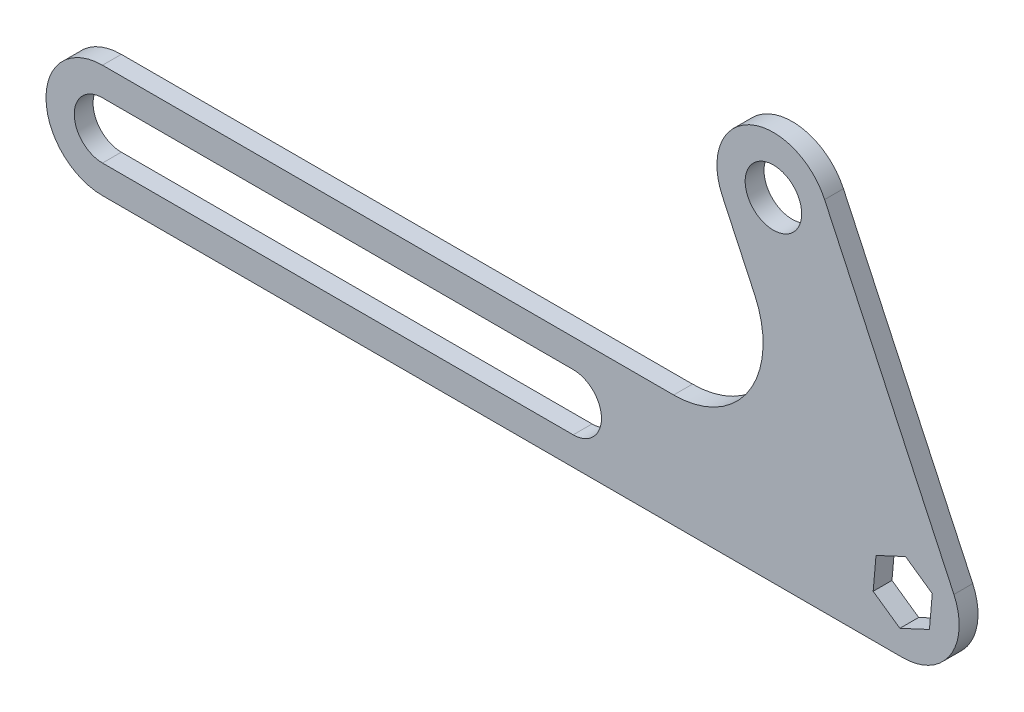
ISO-10303-21;
HEADER;
FILE_DESCRIPTION(('STEP AP214'),'2;1');
FILE_NAME('part.step','',(''),(''),'','','');
FILE_SCHEMA(('AUTOMOTIVE_DESIGN { 1 0 10303 214 1 1 1 1 }'));
ENDSEC;
DATA;
#1=APPLICATION_CONTEXT('core data for automotive mechanical design processes');
#2=APPLICATION_PROTOCOL_DEFINITION('international standard','automotive_design',2000,#1);
#3=PRODUCT_CONTEXT('',#1,'mechanical');
#4=PRODUCT('Part','Part','',(#3));
#5=PRODUCT_RELATED_PRODUCT_CATEGORY('part','',(#4));
#6=PRODUCT_DEFINITION_FORMATION('','',#4);
#7=PRODUCT_DEFINITION_CONTEXT('part definition',#1,'design');
#8=PRODUCT_DEFINITION('design','',#6,#7);
#9=PRODUCT_DEFINITION_SHAPE('','',#8);
#10=(LENGTH_UNIT() NAMED_UNIT(*) SI_UNIT(.MILLI.,.METRE.));
#11=(NAMED_UNIT(*) PLANE_ANGLE_UNIT() SI_UNIT($,.RADIAN.));
#12=(NAMED_UNIT(*) SI_UNIT($,.STERADIAN.) SOLID_ANGLE_UNIT());
#13=UNCERTAINTY_MEASURE_WITH_UNIT(LENGTH_MEASURE(1.E-05),#10,'distance_accuracy_value','');
#14=(GEOMETRIC_REPRESENTATION_CONTEXT(3) GLOBAL_UNCERTAINTY_ASSIGNED_CONTEXT((#13)) GLOBAL_UNIT_ASSIGNED_CONTEXT((#10,
#11,#12)) REPRESENTATION_CONTEXT('',''));
#15=CARTESIAN_POINT('',(0.,0.,0.));
#16=DIRECTION('',(0.,0.,1.));
#17=DIRECTION('',(1.,0.,0.));
#18=AXIS2_PLACEMENT_3D('',#15,#16,#17);
#19=CARTESIAN_POINT('',(-10.8756934444398,-5.07141914088846,4.));
#20=DIRECTION('',(-0.906307787036648,-0.422618261740703,0.));
#21=DIRECTION('',(0.422618261740703,-0.906307787036648,0.));
#22=AXIS2_PLACEMENT_3D('',#19,#20,#21);
#23=PLANE('',#22);
#24=DIRECTION('',(-0.422618261740703,0.906307787036648,0.));
#25=VECTOR('',#24,1.);
#26=CARTESIAN_POINT('',(-10.8756934444398,-5.07141914088846,0.));
#27=LINE('',#26,#25);
#28=CARTESIAN_POINT('',(-31.4404049369462,39.0297469730734,0.));
#29=VERTEX_POINT('',#28);
#30=CARTESIAN_POINT('',(-38.3458804575855,53.8385870164937,0.));
#31=VERTEX_POINT('',#30);
#32=EDGE_CURVE('E303',#29,#31,#27,.T.);
#33=ORIENTED_EDGE('',*,*,#32,.F.);
#34=DIRECTION('',(0.,0.,-1.));
#35=VECTOR('',#34,1.);
#36=CARTESIAN_POINT('',(-31.4404049369462,39.0297469730734,4.));
#37=LINE('',#36,#35);
#38=CARTESIAN_POINT('',(-31.4404049369462,39.0297469730734,4.));
#39=VERTEX_POINT('',#38);
#40=EDGE_CURVE('E11',#39,#29,#37,.T.);
#41=ORIENTED_EDGE('',*,*,#40,.F.);
#42=DIRECTION('',(-0.422618261740703,0.906307787036648,0.));
#43=VECTOR('',#42,1.);
#44=CARTESIAN_POINT('',(-10.8756934444398,-5.07141914088846,4.));
#45=LINE('',#44,#43);
#46=CARTESIAN_POINT('',(-38.3458804575855,53.8385870164937,4.));
#47=VERTEX_POINT('',#46);
#48=EDGE_CURVE('E371',#39,#47,#45,.T.);
#49=ORIENTED_EDGE('',*,*,#48,.T.);
#50=DIRECTION('',(0.,0.,-1.));
#51=VECTOR('',#50,1.);
#52=CARTESIAN_POINT('',(-38.3458804575855,53.8385870164937,4.));
#53=LINE('',#52,#51);
#54=EDGE_CURVE('E125',#47,#31,#53,.T.);
#55=ORIENTED_EDGE('',*,*,#54,.T.);
#56=EDGE_LOOP('',(#33,#41,#49,#55));
#57=FACE_BOUND('',#56,.T.);
#58=ADVANCED_FACE('F41',(#57),#23,.T.);
#59=CARTESIAN_POINT('',(-48.6602528906427,31.,4.));
#60=DIRECTION('',(0.,0.,-1.));
#61=DIRECTION('',(-1.,0.,0.));
#62=AXIS2_PLACEMENT_3D('',#59,#60,#61);
#63=CYLINDRICAL_SURFACE('',#62,19.0000000000001);
#64=CARTESIAN_POINT('',(-48.6602528906427,31.,0.));
#65=DIRECTION('',(0.,0.,1.));
#66=DIRECTION('',(1.,0.,0.));
#67=AXIS2_PLACEMENT_3D('',#64,#65,#66);
#68=CIRCLE('',#67,19.0000000000001);
#69=CARTESIAN_POINT('',(-48.6602528906425,12.,0.));
#70=VERTEX_POINT('',#69);
#71=EDGE_CURVE('E306',#29,#70,#68,.F.);
#72=ORIENTED_EDGE('',*,*,#71,.T.);
#73=DIRECTION('',(0.,0.,-1.));
#74=VECTOR('',#73,1.);
#75=CARTESIAN_POINT('',(-48.6602528906425,12.,4.));
#76=LINE('',#75,#74);
#77=CARTESIAN_POINT('',(-48.6602528906425,12.,4.));
#78=VERTEX_POINT('',#77);
#79=EDGE_CURVE('E52',#78,#70,#76,.T.);
#80=ORIENTED_EDGE('',*,*,#79,.F.);
#81=CARTESIAN_POINT('',(-48.6602528906427,31.,4.));
#82=DIRECTION('',(0.,0.,1.));
#83=DIRECTION('',(1.,0.,0.));
#84=AXIS2_PLACEMENT_3D('',#81,#82,#83);
#85=CIRCLE('',#84,19.0000000000001);
#86=EDGE_CURVE('E374',#39,#78,#85,.F.);
#87=ORIENTED_EDGE('',*,*,#86,.F.);
#88=ORIENTED_EDGE('',*,*,#40,.T.);
#89=EDGE_LOOP('',(#72,#80,#87,#88));
#90=FACE_BOUND('',#89,.T.);
#91=ADVANCED_FACE('F401',(#90),#63,.F.);
#92=CARTESIAN_POINT('',(0.,12.,4.));
#93=DIRECTION('',(0.,1.,0.));
#94=DIRECTION('',(0.,0.,1.));
#95=AXIS2_PLACEMENT_3D('',#92,#93,#94);
#96=PLANE('',#95);
#97=DIRECTION('',(1.,0.,0.));
#98=VECTOR('',#97,1.);
#99=CARTESIAN_POINT('',(0.,12.,0.));
#100=LINE('',#99,#98);
#101=CARTESIAN_POINT('',(-170.,12.,0.));
#102=VERTEX_POINT('',#101);
#103=EDGE_CURVE('E310',#102,#70,#100,.T.);
#104=ORIENTED_EDGE('',*,*,#103,.F.);
#105=DIRECTION('',(0.,0.,-1.));
#106=VECTOR('',#105,1.);
#107=CARTESIAN_POINT('',(-170.,12.,4.));
#108=LINE('',#107,#106);
#109=CARTESIAN_POINT('',(-170.,12.,4.));
#110=VERTEX_POINT('',#109);
#111=EDGE_CURVE('E213',#110,#102,#108,.T.);
#112=ORIENTED_EDGE('',*,*,#111,.F.);
#113=DIRECTION('',(1.,0.,0.));
#114=VECTOR('',#113,1.);
#115=CARTESIAN_POINT('',(0.,12.,4.));
#116=LINE('',#115,#114);
#117=EDGE_CURVE('E377',#110,#78,#116,.T.);
#118=ORIENTED_EDGE('',*,*,#117,.T.);
#119=ORIENTED_EDGE('',*,*,#79,.T.);
#120=EDGE_LOOP('',(#104,#112,#118,#119));
#121=FACE_BOUND('',#120,.T.);
#122=ADVANCED_FACE('F397',(#121),#96,.T.);
#123=CARTESIAN_POINT('',(-170.,0.,4.));
#124=DIRECTION('',(0.,0.,-1.));
#125=DIRECTION('',(-1.,0.,0.));
#126=AXIS2_PLACEMENT_3D('',#123,#124,#125);
#127=CYLINDRICAL_SURFACE('',#126,12.);
#128=CARTESIAN_POINT('',(-170.,0.,0.));
#129=DIRECTION('',(0.,0.,1.));
#130=DIRECTION('',(1.,0.,0.));
#131=AXIS2_PLACEMENT_3D('',#128,#129,#130);
#132=CIRCLE('',#131,12.);
#133=CARTESIAN_POINT('',(-170.,-12.,0.));
#134=VERTEX_POINT('',#133);
#135=EDGE_CURVE('E314',#102,#134,#132,.T.);
#136=ORIENTED_EDGE('',*,*,#135,.T.);
#137=DIRECTION('',(0.,0.,-1.));
#138=VECTOR('',#137,1.);
#139=CARTESIAN_POINT('',(-170.,-12.,4.));
#140=LINE('',#139,#138);
#141=CARTESIAN_POINT('',(-170.,-12.,4.));
#142=VERTEX_POINT('',#141);
#143=EDGE_CURVE('E205',#142,#134,#140,.T.);
#144=ORIENTED_EDGE('',*,*,#143,.F.);
#145=CARTESIAN_POINT('',(-170.,0.,4.));
#146=DIRECTION('',(0.,0.,1.));
#147=DIRECTION('',(1.,0.,0.));
#148=AXIS2_PLACEMENT_3D('',#145,#146,#147);
#149=CIRCLE('',#148,12.);
#150=EDGE_CURVE('E381',#110,#142,#149,.T.);
#151=ORIENTED_EDGE('',*,*,#150,.F.);
#152=ORIENTED_EDGE('',*,*,#111,.T.);
#153=EDGE_LOOP('',(#136,#144,#151,#152));
#154=FACE_BOUND('',#153,.T.);
#155=ADVANCED_FACE('F390',(#154),#127,.T.);
#156=CARTESIAN_POINT('',(0.,-12.,4.));
#157=DIRECTION('',(0.,1.,0.));
#158=DIRECTION('',(-1.,0.,0.));
#159=AXIS2_PLACEMENT_3D('',#156,#157,#158);
#160=PLANE('',#159);
#161=DIRECTION('',(1.,0.,0.));
#162=VECTOR('',#161,1.);
#163=CARTESIAN_POINT('',(0.,-12.,0.));
#164=LINE('',#163,#162);
#165=CARTESIAN_POINT('',(0.,-12.,0.));
#166=VERTEX_POINT('',#165);
#167=EDGE_CURVE('E318',#134,#166,#164,.T.);
#168=ORIENTED_EDGE('',*,*,#167,.T.);
#169=DIRECTION('',(0.,0.,-1.));
#170=VECTOR('',#169,1.);
#171=CARTESIAN_POINT('',(0.,-12.,4.));
#172=LINE('',#171,#170);
#173=CARTESIAN_POINT('',(0.,-12.,4.));
#174=VERTEX_POINT('',#173);
#175=EDGE_CURVE('E201',#174,#166,#172,.T.);
#176=ORIENTED_EDGE('',*,*,#175,.F.);
#177=DIRECTION('',(1.,0.,0.));
#178=VECTOR('',#177,1.);
#179=CARTESIAN_POINT('',(0.,-12.,4.));
#180=LINE('',#179,#178);
#181=EDGE_CURVE('E192',#142,#174,#180,.T.);
#182=ORIENTED_EDGE('',*,*,#181,.F.);
#183=ORIENTED_EDGE('',*,*,#143,.T.);
#184=EDGE_LOOP('',(#168,#176,#182,#183));
#185=FACE_BOUND('',#184,.T.);
#186=ADVANCED_FACE('F393',(#185),#160,.F.);
#187=CARTESIAN_POINT('',(0.,0.,4.));
#188=DIRECTION('',(0.,0.,-1.));
#189=DIRECTION('',(-1.,0.,0.));
#190=AXIS2_PLACEMENT_3D('',#187,#188,#189);
#191=CYLINDRICAL_SURFACE('',#190,12.);
#192=CARTESIAN_POINT('',(0.,0.,0.));
#193=DIRECTION('',(0.,0.,1.));
#194=DIRECTION('',(1.,0.,0.));
#195=AXIS2_PLACEMENT_3D('',#192,#193,#194);
#196=CIRCLE('',#195,12.);
#197=CARTESIAN_POINT('',(10.8756934444398,5.07141914088845,0.));
#198=VERTEX_POINT('',#197);
#199=EDGE_CURVE('E199',#166,#198,#196,.T.);
#200=ORIENTED_EDGE('',*,*,#199,.T.);
#201=DIRECTION('',(0.,0.,-1.));
#202=VECTOR('',#201,1.);
#203=CARTESIAN_POINT('',(10.8756934444398,5.07141914088845,4.));
#204=LINE('',#203,#202);
#205=CARTESIAN_POINT('',(10.8756934444398,5.07141914088845,4.));
#206=VERTEX_POINT('',#205);
#207=EDGE_CURVE('E183',#206,#198,#204,.T.);
#208=ORIENTED_EDGE('',*,*,#207,.F.);
#209=CARTESIAN_POINT('',(0.,0.,4.));
#210=DIRECTION('',(0.,0.,1.));
#211=DIRECTION('',(1.,0.,0.));
#212=AXIS2_PLACEMENT_3D('',#209,#210,#211);
#213=CIRCLE('',#212,12.);
#214=EDGE_CURVE('E187',#174,#206,#213,.T.);
#215=ORIENTED_EDGE('',*,*,#214,.F.);
#216=ORIENTED_EDGE('',*,*,#175,.T.);
#217=EDGE_LOOP('',(#200,#208,#215,#216));
#218=FACE_BOUND('',#217,.T.);
#219=ADVANCED_FACE('F198',(#218),#191,.T.);
#220=CARTESIAN_POINT('',(10.8756934444398,5.07141914088845,4.));
#221=DIRECTION('',(-0.906307787036648,-0.422618261740704,0.));
#222=DIRECTION('',(0.422618261740704,-0.906307787036648,0.));
#223=AXIS2_PLACEMENT_3D('',#220,#221,#222);
#224=PLANE('',#223);
#225=DIRECTION('',(-0.422618261740704,0.906307787036648,0.));
#226=VECTOR('',#225,1.);
#227=CARTESIAN_POINT('',(10.8756934444398,5.07141914088845,0.));
#228=LINE('',#227,#226);
#229=CARTESIAN_POINT('',(-16.594493568706,63.9814252982705,0.));
#230=VERTEX_POINT('',#229);
#231=EDGE_CURVE('E324',#198,#230,#228,.T.);
#232=ORIENTED_EDGE('',*,*,#231,.T.);
#233=DIRECTION('',(0.,0.,-1.));
#234=VECTOR('',#233,1.);
#235=CARTESIAN_POINT('',(-16.594493568706,63.9814252982705,4.));
#236=LINE('',#235,#234);
#237=CARTESIAN_POINT('',(-16.594493568706,63.9814252982705,4.));
#238=VERTEX_POINT('',#237);
#239=EDGE_CURVE('E185',#238,#230,#236,.T.);
#240=ORIENTED_EDGE('',*,*,#239,.F.);
#241=DIRECTION('',(-0.422618261740704,0.906307787036648,0.));
#242=VECTOR('',#241,1.);
#243=CARTESIAN_POINT('',(10.8756934444398,5.07141914088845,4.));
#244=LINE('',#243,#242);
#245=EDGE_CURVE('E178',#206,#238,#244,.T.);
#246=ORIENTED_EDGE('',*,*,#245,.F.);
#247=ORIENTED_EDGE('',*,*,#207,.T.);
#248=EDGE_LOOP('',(#232,#240,#246,#247));
#249=FACE_BOUND('',#248,.T.);
#250=ADVANCED_FACE('F181',(#249),#224,.F.);
#251=CARTESIAN_POINT('',(-70.,0.,4.));
#252=DIRECTION('',(0.,0.,-1.));
#253=DIRECTION('',(-1.,0.,0.));
#254=AXIS2_PLACEMENT_3D('',#251,#252,#253);
#255=CYLINDRICAL_SURFACE('',#254,6.);
#256=CARTESIAN_POINT('',(-70.,0.,0.));
#257=DIRECTION('',(0.,0.,1.));
#258=DIRECTION('',(1.,0.,0.));
#259=AXIS2_PLACEMENT_3D('',#256,#257,#258);
#260=CIRCLE('',#259,6.);
#261=CARTESIAN_POINT('',(-70.,-6.,0.));
#262=VERTEX_POINT('',#261);
#263=CARTESIAN_POINT('',(-70.,6.,0.));
#264=VERTEX_POINT('',#263);
#265=EDGE_CURVE('E283',#262,#264,#260,.T.);
#266=ORIENTED_EDGE('',*,*,#265,.F.);
#267=DIRECTION('',(0.,0.,-1.));
#268=VECTOR('',#267,1.);
#269=CARTESIAN_POINT('',(-70.,-6.,4.));
#270=LINE('',#269,#268);
#271=CARTESIAN_POINT('',(-70.,-6.,4.));
#272=VERTEX_POINT('',#271);
#273=EDGE_CURVE('E227',#272,#262,#270,.T.);
#274=ORIENTED_EDGE('',*,*,#273,.F.);
#275=CARTESIAN_POINT('',(-70.,0.,4.));
#276=DIRECTION('',(0.,0.,1.));
#277=DIRECTION('',(1.,0.,0.));
#278=AXIS2_PLACEMENT_3D('',#275,#276,#277);
#279=CIRCLE('',#278,6.);
#280=CARTESIAN_POINT('',(-70.,6.,4.));
#281=VERTEX_POINT('',#280);
#282=EDGE_CURVE('E352',#272,#281,#279,.T.);
#283=ORIENTED_EDGE('',*,*,#282,.T.);
#284=DIRECTION('',(0.,0.,-1.));
#285=VECTOR('',#284,1.);
#286=CARTESIAN_POINT('',(-70.,6.,4.));
#287=LINE('',#286,#285);
#288=EDGE_CURVE('E218',#281,#264,#287,.T.);
#289=ORIENTED_EDGE('',*,*,#288,.T.);
#290=EDGE_LOOP('',(#266,#274,#283,#289));
#291=FACE_BOUND('',#290,.T.);
#292=ADVANCED_FACE('F427',(#291),#255,.F.);
#293=CARTESIAN_POINT('',(0.,-6.,4.));
#294=DIRECTION('',(0.,1.,0.));
#295=DIRECTION('',(0.,0.,1.));
#296=AXIS2_PLACEMENT_3D('',#293,#294,#295);
#297=PLANE('',#296);
#298=DIRECTION('',(1.,0.,0.));
#299=VECTOR('',#298,1.);
#300=CARTESIAN_POINT('',(0.,-6.,0.));
#301=LINE('',#300,#299);
#302=CARTESIAN_POINT('',(-170.,-6.,0.));
#303=VERTEX_POINT('',#302);
#304=EDGE_CURVE('E287',#303,#262,#301,.T.);
#305=ORIENTED_EDGE('',*,*,#304,.F.);
#306=DIRECTION('',(0.,0.,-1.));
#307=VECTOR('',#306,1.);
#308=CARTESIAN_POINT('',(-170.,-6.,4.));
#309=LINE('',#308,#307);
#310=CARTESIAN_POINT('',(-170.,-6.,4.));
#311=VERTEX_POINT('',#310);
#312=EDGE_CURVE('E224',#311,#303,#309,.T.);
#313=ORIENTED_EDGE('',*,*,#312,.F.);
#314=DIRECTION('',(1.,0.,0.));
#315=VECTOR('',#314,1.);
#316=CARTESIAN_POINT('',(0.,-6.,4.));
#317=LINE('',#316,#315);
#318=EDGE_CURVE('E356',#311,#272,#317,.T.);
#319=ORIENTED_EDGE('',*,*,#318,.T.);
#320=ORIENTED_EDGE('',*,*,#273,.T.);
#321=EDGE_LOOP('',(#305,#313,#319,#320));
#322=FACE_BOUND('',#321,.T.);
#323=ADVANCED_FACE('F423',(#322),#297,.T.);
#324=CARTESIAN_POINT('',(-170.,0.,4.));
#325=DIRECTION('',(0.,0.,-1.));
#326=DIRECTION('',(-1.,0.,0.));
#327=AXIS2_PLACEMENT_3D('',#324,#325,#326);
#328=CYLINDRICAL_SURFACE('',#327,6.);
#329=CARTESIAN_POINT('',(-170.,0.,0.));
#330=DIRECTION('',(0.,0.,1.));
#331=DIRECTION('',(1.,0.,0.));
#332=AXIS2_PLACEMENT_3D('',#329,#330,#331);
#333=CIRCLE('',#332,6.);
#334=CARTESIAN_POINT('',(-170.,6.,0.));
#335=VERTEX_POINT('',#334);
#336=EDGE_CURVE('E291',#335,#303,#333,.T.);
#337=ORIENTED_EDGE('',*,*,#336,.F.);
#338=DIRECTION('',(0.,0.,-1.));
#339=VECTOR('',#338,1.);
#340=CARTESIAN_POINT('',(-170.,6.,4.));
#341=LINE('',#340,#339);
#342=CARTESIAN_POINT('',(-170.,6.,4.));
#343=VERTEX_POINT('',#342);
#344=EDGE_CURVE('E221',#343,#335,#341,.T.);
#345=ORIENTED_EDGE('',*,*,#344,.F.);
#346=CARTESIAN_POINT('',(-170.,0.,4.));
#347=DIRECTION('',(0.,0.,1.));
#348=DIRECTION('',(1.,0.,0.));
#349=AXIS2_PLACEMENT_3D('',#346,#347,#348);
#350=CIRCLE('',#349,6.);
#351=EDGE_CURVE('E360',#343,#311,#350,.T.);
#352=ORIENTED_EDGE('',*,*,#351,.T.);
#353=ORIENTED_EDGE('',*,*,#312,.T.);
#354=EDGE_LOOP('',(#337,#345,#352,#353));
#355=FACE_BOUND('',#354,.T.);
#356=ADVANCED_FACE('F420',(#355),#328,.F.);
#357=CARTESIAN_POINT('',(5.97716818855047,-0.522934456485918,4.));
#358=DIRECTION('',(-0.996194698091746,0.0871557427476532,0.));
#359=DIRECTION('',(-0.0871557427476532,-0.996194698091746,0.));
#360=AXIS2_PLACEMENT_3D('',#357,#358,#359);
#361=PLANE('',#360);
#362=DIRECTION('',(0.0871557427476532,0.996194698091746,0.));
#363=VECTOR('',#362,1.);
#364=CARTESIAN_POINT('',(5.97716818855047,-0.522934456485918,0.));
#365=LINE('',#364,#363);
#366=CARTESIAN_POINT('',(5.67525183932979,-3.97385411913719,0.));
#367=VERTEX_POINT('',#366);
#368=CARTESIAN_POINT('',(6.27908453777114,2.92798520616538,0.));
#369=VERTEX_POINT('',#368);
#370=EDGE_CURVE('E257',#367,#369,#365,.T.);
#371=ORIENTED_EDGE('',*,*,#370,.F.);
#372=DIRECTION('',(0.,0.,-1.));
#373=VECTOR('',#372,1.);
#374=CARTESIAN_POINT('',(5.67525183932979,-3.97385411913719,4.));
#375=LINE('',#374,#373);
#376=CARTESIAN_POINT('',(5.67525183932979,-3.97385411913719,4.));
#377=VERTEX_POINT('',#376);
#378=EDGE_CURVE('E45',#377,#367,#375,.T.);
#379=ORIENTED_EDGE('',*,*,#378,.F.);
#380=DIRECTION('',(0.0871557427476532,0.996194698091746,0.));
#381=VECTOR('',#380,1.);
#382=CARTESIAN_POINT('',(5.97716818855047,-0.522934456485918,4.));
#383=LINE('',#382,#381);
#384=CARTESIAN_POINT('',(6.27908453777114,2.92798520616538,4.));
#385=VERTEX_POINT('',#384);
#386=EDGE_CURVE('E328',#377,#385,#383,.T.);
#387=ORIENTED_EDGE('',*,*,#386,.T.);
#388=DIRECTION('',(0.,0.,-1.));
#389=VECTOR('',#388,1.);
#390=CARTESIAN_POINT('',(6.27908453777114,2.92798520616538,4.));
#391=LINE('',#390,#389);
#392=EDGE_CURVE('E230',#385,#369,#391,.T.);
#393=ORIENTED_EDGE('',*,*,#392,.T.);
#394=EDGE_LOOP('',(#371,#379,#387,#393));
#395=FACE_BOUND('',#394,.T.);
#396=ADVANCED_FACE('F43',(#395),#361,.T.);
#397=CARTESIAN_POINT('',(2.53570957044422,-5.43784672221987,4.));
#398=DIRECTION('',(-0.422618261740705,0.906307787036647,0.));
#399=DIRECTION('',(-0.906307787036648,-0.422618261740705,0.));
#400=AXIS2_PLACEMENT_3D('',#397,#398,#399);
#401=PLANE('',#400);
#402=DIRECTION('',(0.906307787036648,0.422618261740705,0.));
#403=VECTOR('',#402,1.);
#404=CARTESIAN_POINT('',(2.53570957044422,-5.43784672221987,0.));
#405=LINE('',#404,#403);
#406=CARTESIAN_POINT('',(-0.603832698441352,-6.90183932530256,0.));
#407=VERTEX_POINT('',#406);
#408=EDGE_CURVE('E252',#407,#367,#405,.T.);
#409=ORIENTED_EDGE('',*,*,#408,.F.);
#410=DIRECTION('',(0.,0.,-1.));
#411=VECTOR('',#410,1.);
#412=CARTESIAN_POINT('',(-0.603832698441352,-6.90183932530256,4.));
#413=LINE('',#412,#411);
#414=CARTESIAN_POINT('',(-0.603832698441352,-6.90183932530256,4.));
#415=VERTEX_POINT('',#414);
#416=EDGE_CURVE('E241',#415,#407,#413,.T.);
#417=ORIENTED_EDGE('',*,*,#416,.F.);
#418=DIRECTION('',(0.906307787036648,0.422618261740705,0.));
#419=VECTOR('',#418,1.);
#420=CARTESIAN_POINT('',(2.53570957044422,-5.43784672221987,4.));
#421=LINE('',#420,#419);
#422=EDGE_CURVE('E255',#415,#377,#421,.T.);
#423=ORIENTED_EDGE('',*,*,#422,.T.);
#424=ORIENTED_EDGE('',*,*,#378,.T.);
#425=EDGE_LOOP('',(#409,#417,#423,#424));
#426=FACE_BOUND('',#425,.T.);
#427=ADVANCED_FACE('F250',(#426),#401,.T.);
#428=CARTESIAN_POINT('',(-3.44145861810624,-4.91491226573397,4.));
#429=DIRECTION('',(0.573576436351041,0.819152044288995,0.));
#430=DIRECTION('',(-0.819152044288995,0.573576436351041,0.));
#431=AXIS2_PLACEMENT_3D('',#428,#429,#430);
#432=PLANE('',#431);
#433=DIRECTION('',(0.819152044288995,-0.573576436351041,0.));
#434=VECTOR('',#433,1.);
#435=CARTESIAN_POINT('',(-3.44145861810624,-4.91491226573397,0.));
#436=LINE('',#435,#434);
#437=CARTESIAN_POINT('',(-6.27908453777115,-2.92798520616537,0.));
#438=VERTEX_POINT('',#437);
#439=EDGE_CURVE('E266',#438,#407,#436,.T.);
#440=ORIENTED_EDGE('',*,*,#439,.F.);
#441=DIRECTION('',(0.,0.,-1.));
#442=VECTOR('',#441,1.);
#443=CARTESIAN_POINT('',(-6.27908453777115,-2.92798520616537,4.));
#444=LINE('',#443,#442);
#445=CARTESIAN_POINT('',(-6.27908453777115,-2.92798520616537,4.));
#446=VERTEX_POINT('',#445);
#447=EDGE_CURVE('E239',#446,#438,#444,.T.);
#448=ORIENTED_EDGE('',*,*,#447,.F.);
#449=DIRECTION('',(0.819152044288995,-0.573576436351041,0.));
#450=VECTOR('',#449,1.);
#451=CARTESIAN_POINT('',(-3.44145861810624,-4.91491226573397,4.));
#452=LINE('',#451,#450);
#453=EDGE_CURVE('E335',#446,#415,#452,.T.);
#454=ORIENTED_EDGE('',*,*,#453,.T.);
#455=ORIENTED_EDGE('',*,*,#416,.T.);
#456=EDGE_LOOP('',(#440,#448,#454,#455));
#457=FACE_BOUND('',#456,.T.);
#458=ADVANCED_FACE('F442',(#457),#432,.T.);
#459=CARTESIAN_POINT('',(-5.97716818855047,0.522934456485918,4.));
#460=DIRECTION('',(0.996194698091746,-0.0871557427476531,0.));
#461=DIRECTION('',(0.0871557427476531,0.996194698091746,0.));
#462=AXIS2_PLACEMENT_3D('',#459,#460,#461);
#463=PLANE('',#462);
#464=DIRECTION('',(-0.0871557427476531,-0.996194698091746,0.));
#465=VECTOR('',#464,1.);
#466=CARTESIAN_POINT('',(-5.97716818855047,0.522934456485918,0.));
#467=LINE('',#466,#465);
#468=CARTESIAN_POINT('',(-5.67525183932979,3.9738541191372,0.));
#469=VERTEX_POINT('',#468);
#470=EDGE_CURVE('E270',#469,#438,#467,.T.);
#471=ORIENTED_EDGE('',*,*,#470,.F.);
#472=DIRECTION('',(0.,0.,-1.));
#473=VECTOR('',#472,1.);
#474=CARTESIAN_POINT('',(-5.67525183932979,3.9738541191372,4.));
#475=LINE('',#474,#473);
#476=CARTESIAN_POINT('',(-5.67525183932979,3.9738541191372,4.));
#477=VERTEX_POINT('',#476);
#478=EDGE_CURVE('E236',#477,#469,#475,.T.);
#479=ORIENTED_EDGE('',*,*,#478,.F.);
#480=DIRECTION('',(-0.0871557427476531,-0.996194698091746,0.));
#481=VECTOR('',#480,1.);
#482=CARTESIAN_POINT('',(-5.97716818855047,0.522934456485918,4.));
#483=LINE('',#482,#481);
#484=EDGE_CURVE('E340',#477,#446,#483,.T.);
#485=ORIENTED_EDGE('',*,*,#484,.T.);
#486=ORIENTED_EDGE('',*,*,#447,.T.);
#487=EDGE_LOOP('',(#471,#479,#485,#486));
#488=FACE_BOUND('',#487,.T.);
#489=ADVANCED_FACE('F438',(#488),#463,.T.);
#490=CARTESIAN_POINT('',(-2.53570957044422,5.43784672221988,4.));
#491=DIRECTION('',(0.422618261740704,-0.906307787036648,0.));
#492=DIRECTION('',(0.906307787036648,0.422618261740704,0.));
#493=AXIS2_PLACEMENT_3D('',#490,#491,#492);
#494=PLANE('',#493);
#495=DIRECTION('',(-0.906307787036648,-0.422618261740704,0.));
#496=VECTOR('',#495,1.);
#497=CARTESIAN_POINT('',(-2.53570957044422,5.43784672221988,0.));
#498=LINE('',#497,#496);
#499=CARTESIAN_POINT('',(0.603832698441351,6.90183932530256,0.));
#500=VERTEX_POINT('',#499);
#501=EDGE_CURVE('E276',#500,#469,#498,.T.);
#502=ORIENTED_EDGE('',*,*,#501,.F.);
#503=DIRECTION('',(0.,0.,-1.));
#504=VECTOR('',#503,1.);
#505=CARTESIAN_POINT('',(0.603832698441351,6.90183932530256,4.));
#506=LINE('',#505,#504);
#507=CARTESIAN_POINT('',(0.603832698441351,6.90183932530256,4.));
#508=VERTEX_POINT('',#507);
#509=EDGE_CURVE('E233',#508,#500,#506,.T.);
#510=ORIENTED_EDGE('',*,*,#509,.F.);
#511=DIRECTION('',(-0.906307787036648,-0.422618261740704,0.));
#512=VECTOR('',#511,1.);
#513=CARTESIAN_POINT('',(-2.53570957044422,5.43784672221988,4.));
#514=LINE('',#513,#512);
#515=EDGE_CURVE('E344',#508,#477,#514,.T.);
#516=ORIENTED_EDGE('',*,*,#515,.T.);
#517=ORIENTED_EDGE('',*,*,#478,.T.);
#518=EDGE_LOOP('',(#502,#510,#516,#517));
#519=FACE_BOUND('',#518,.T.);
#520=ADVANCED_FACE('F414',(#519),#494,.T.);
#521=CARTESIAN_POINT('',(-27.4701870131458,58.9100061573821,4.));
#522=DIRECTION('',(0.,0.,-1.));
#523=DIRECTION('',(-1.,0.,0.));
#524=AXIS2_PLACEMENT_3D('',#521,#522,#523);
#525=CYLINDRICAL_SURFACE('',#524,6.00000000000001);
#526=CARTESIAN_POINT('',(-27.4701870131458,58.9100061573821,4.));
#527=DIRECTION('',(0.,0.,1.));
#528=DIRECTION('',(1.,0.,0.));
#529=AXIS2_PLACEMENT_3D('',#526,#527,#528);
#530=CIRCLE('',#529,6.00000000000001);
#531=CARTESIAN_POINT('',(-21.4701870131458,58.9100061573821,4.));
#532=VERTEX_POINT('',#531);
#533=EDGE_CURVE('E367',#532,#532,#530,.T.);
#534=ORIENTED_EDGE('',*,*,#533,.T.);
#535=EDGE_LOOP('',(#534));
#536=FACE_BOUND('',#535,.T.);
#537=CARTESIAN_POINT('',(-27.4701870131458,58.9100061573821,0.));
#538=DIRECTION('',(0.,0.,1.));
#539=DIRECTION('',(1.,0.,0.));
#540=AXIS2_PLACEMENT_3D('',#537,#538,#539);
#541=CIRCLE('',#540,6.00000000000001);
#542=CARTESIAN_POINT('',(-21.4701870131458,58.9100061573821,0.));
#543=VERTEX_POINT('',#542);
#544=EDGE_CURVE('E299',#543,#543,#541,.T.);
#545=ORIENTED_EDGE('',*,*,#544,.F.);
#546=EDGE_LOOP('',(#545));
#547=FACE_BOUND('',#546,.T.);
#548=ADVANCED_FACE('F410',(#536,#547),#525,.F.);
#549=CARTESIAN_POINT('',(0.,6.,4.));
#550=DIRECTION('',(0.,1.,0.));
#551=DIRECTION('',(0.,0.,1.));
#552=AXIS2_PLACEMENT_3D('',#549,#550,#551);
#553=PLANE('',#552);
#554=DIRECTION('',(1.,0.,0.));
#555=VECTOR('',#554,1.);
#556=CARTESIAN_POINT('',(0.,6.,0.));
#557=LINE('',#556,#555);
#558=EDGE_CURVE('E295',#335,#264,#557,.T.);
#559=ORIENTED_EDGE('',*,*,#558,.T.);
#560=ORIENTED_EDGE('',*,*,#288,.F.);
#561=DIRECTION('',(1.,0.,0.));
#562=VECTOR('',#561,1.);
#563=CARTESIAN_POINT('',(0.,6.,4.));
#564=LINE('',#563,#562);
#565=EDGE_CURVE('E364',#343,#281,#564,.T.);
#566=ORIENTED_EDGE('',*,*,#565,.F.);
#567=ORIENTED_EDGE('',*,*,#344,.T.);
#568=EDGE_LOOP('',(#559,#560,#566,#567));
#569=FACE_BOUND('',#568,.T.);
#570=ADVANCED_FACE('F413',(#569),#553,.F.);
#571=CARTESIAN_POINT('',(3.44145861810624,4.91491226573398,4.));
#572=DIRECTION('',(-0.57357643635104,-0.819152044288996,0.));
#573=DIRECTION('',(0.819152044288996,-0.57357643635104,0.));
#574=AXIS2_PLACEMENT_3D('',#571,#572,#573);
#575=PLANE('',#574);
#576=DIRECTION('',(-0.819152044288996,0.57357643635104,0.));
#577=VECTOR('',#576,1.);
#578=CARTESIAN_POINT('',(3.44145861810624,4.91491226573398,0.));
#579=LINE('',#578,#577);
#580=EDGE_CURVE('E280',#369,#500,#579,.T.);
#581=ORIENTED_EDGE('',*,*,#580,.F.);
#582=ORIENTED_EDGE('',*,*,#392,.F.);
#583=DIRECTION('',(-0.819152044288996,0.57357643635104,0.));
#584=VECTOR('',#583,1.);
#585=CARTESIAN_POINT('',(3.44145861810624,4.91491226573398,4.));
#586=LINE('',#585,#584);
#587=EDGE_CURVE('E348',#385,#508,#586,.T.);
#588=ORIENTED_EDGE('',*,*,#587,.T.);
#589=ORIENTED_EDGE('',*,*,#509,.T.);
#590=EDGE_LOOP('',(#581,#582,#588,#589));
#591=FACE_BOUND('',#590,.T.);
#592=ADVANCED_FACE('F418',(#591),#575,.T.);
#593=CARTESIAN_POINT('',(-27.4701870131458,58.9100061573821,4.));
#594=DIRECTION('',(0.,0.,-1.));
#595=DIRECTION('',(-1.,0.,0.));
#596=AXIS2_PLACEMENT_3D('',#593,#594,#595);
#597=CYLINDRICAL_SURFACE('',#596,12.);
#598=CARTESIAN_POINT('',(-27.4701870131458,58.9100061573821,0.));
#599=DIRECTION('',(0.,0.,1.));
#600=DIRECTION('',(1.,0.,0.));
#601=AXIS2_PLACEMENT_3D('',#598,#599,#600);
#602=CIRCLE('',#601,12.);
#603=EDGE_CURVE('E118',#230,#31,#602,.T.);
#604=ORIENTED_EDGE('',*,*,#603,.T.);
#605=ORIENTED_EDGE('',*,*,#54,.F.);
#606=CARTESIAN_POINT('',(-27.4701870131458,58.9100061573821,4.));
#607=DIRECTION('',(0.,0.,1.));
#608=DIRECTION('',(1.,0.,0.));
#609=AXIS2_PLACEMENT_3D('',#606,#607,#608);
#610=CIRCLE('',#609,12.);
#611=EDGE_CURVE('E61',#238,#47,#610,.T.);
#612=ORIENTED_EDGE('',*,*,#611,.F.);
#613=ORIENTED_EDGE('',*,*,#239,.T.);
#614=EDGE_LOOP('',(#604,#605,#612,#613));
#615=FACE_BOUND('',#614,.T.);
#616=ADVANCED_FACE('F434',(#615),#597,.T.);
#617=CARTESIAN_POINT('',(0.,0.,4.));
#618=DIRECTION('',(0.,0.,1.));
#619=DIRECTION('',(1.,0.,0.));
#620=AXIS2_PLACEMENT_3D('',#617,#618,#619);
#621=PLANE('',#620);
#622=ORIENTED_EDGE('',*,*,#386,.F.);
#623=ORIENTED_EDGE('',*,*,#422,.F.);
#624=ORIENTED_EDGE('',*,*,#453,.F.);
#625=ORIENTED_EDGE('',*,*,#484,.F.);
#626=ORIENTED_EDGE('',*,*,#515,.F.);
#627=ORIENTED_EDGE('',*,*,#587,.F.);
#628=EDGE_LOOP('',(#622,#623,#624,#625,#626,#627));
#629=FACE_BOUND('',#628,.T.);
#630=ORIENTED_EDGE('',*,*,#282,.F.);
#631=ORIENTED_EDGE('',*,*,#318,.F.);
#632=ORIENTED_EDGE('',*,*,#351,.F.);
#633=ORIENTED_EDGE('',*,*,#565,.T.);
#634=EDGE_LOOP('',(#630,#631,#632,#633));
#635=FACE_BOUND('',#634,.T.);
#636=ORIENTED_EDGE('',*,*,#533,.F.);
#637=EDGE_LOOP('',(#636));
#638=FACE_BOUND('',#637,.T.);
#639=ORIENTED_EDGE('',*,*,#48,.F.);
#640=ORIENTED_EDGE('',*,*,#86,.T.);
#641=ORIENTED_EDGE('',*,*,#117,.F.);
#642=ORIENTED_EDGE('',*,*,#150,.T.);
#643=ORIENTED_EDGE('',*,*,#181,.T.);
#644=ORIENTED_EDGE('',*,*,#214,.T.);
#645=ORIENTED_EDGE('',*,*,#245,.T.);
#646=ORIENTED_EDGE('',*,*,#611,.T.);
#647=EDGE_LOOP('',(#639,#640,#641,#642,#643,#644,#645,#646));
#648=FACE_BOUND('',#647,.T.);
#649=ADVANCED_FACE('F190',(#629,#635,#638,#648),#621,.T.);
#650=CARTESIAN_POINT('',(0.,0.,0.));
#651=DIRECTION('',(0.,0.,1.));
#652=DIRECTION('',(1.,0.,0.));
#653=AXIS2_PLACEMENT_3D('',#650,#651,#652);
#654=PLANE('',#653);
#655=ORIENTED_EDGE('',*,*,#370,.T.);
#656=ORIENTED_EDGE('',*,*,#580,.T.);
#657=ORIENTED_EDGE('',*,*,#501,.T.);
#658=ORIENTED_EDGE('',*,*,#470,.T.);
#659=ORIENTED_EDGE('',*,*,#439,.T.);
#660=ORIENTED_EDGE('',*,*,#408,.T.);
#661=EDGE_LOOP('',(#655,#656,#657,#658,#659,#660));
#662=FACE_BOUND('',#661,.T.);
#663=ORIENTED_EDGE('',*,*,#265,.T.);
#664=ORIENTED_EDGE('',*,*,#558,.F.);
#665=ORIENTED_EDGE('',*,*,#336,.T.);
#666=ORIENTED_EDGE('',*,*,#304,.T.);
#667=EDGE_LOOP('',(#663,#664,#665,#666));
#668=FACE_BOUND('',#667,.T.);
#669=ORIENTED_EDGE('',*,*,#544,.T.);
#670=EDGE_LOOP('',(#669));
#671=FACE_BOUND('',#670,.T.);
#672=ORIENTED_EDGE('',*,*,#32,.T.);
#673=ORIENTED_EDGE('',*,*,#603,.F.);
#674=ORIENTED_EDGE('',*,*,#231,.F.);
#675=ORIENTED_EDGE('',*,*,#199,.F.);
#676=ORIENTED_EDGE('',*,*,#167,.F.);
#677=ORIENTED_EDGE('',*,*,#135,.F.);
#678=ORIENTED_EDGE('',*,*,#103,.T.);
#679=ORIENTED_EDGE('',*,*,#71,.F.);
#680=EDGE_LOOP('',(#672,#673,#674,#675,#676,#677,#678,#679));
#681=FACE_BOUND('',#680,.T.);
#682=ADVANCED_FACE('F263',(#662,#668,#671,#681),#654,.F.);
#683=CLOSED_SHELL('',(#58,#91,#122,#155,#186,#219,#250,#292,#323,#356,#396,#427,#458,#489,#520,
#548,#570,#592,#616,#649,#682));
#684=MANIFOLD_SOLID_BREP('B2',#683);
#685=ADVANCED_BREP_SHAPE_REPRESENTATION('',(#18,#684),#14);
#686=SHAPE_DEFINITION_REPRESENTATION(#9,#685);
ENDSEC;
END-ISO-10303-21;
